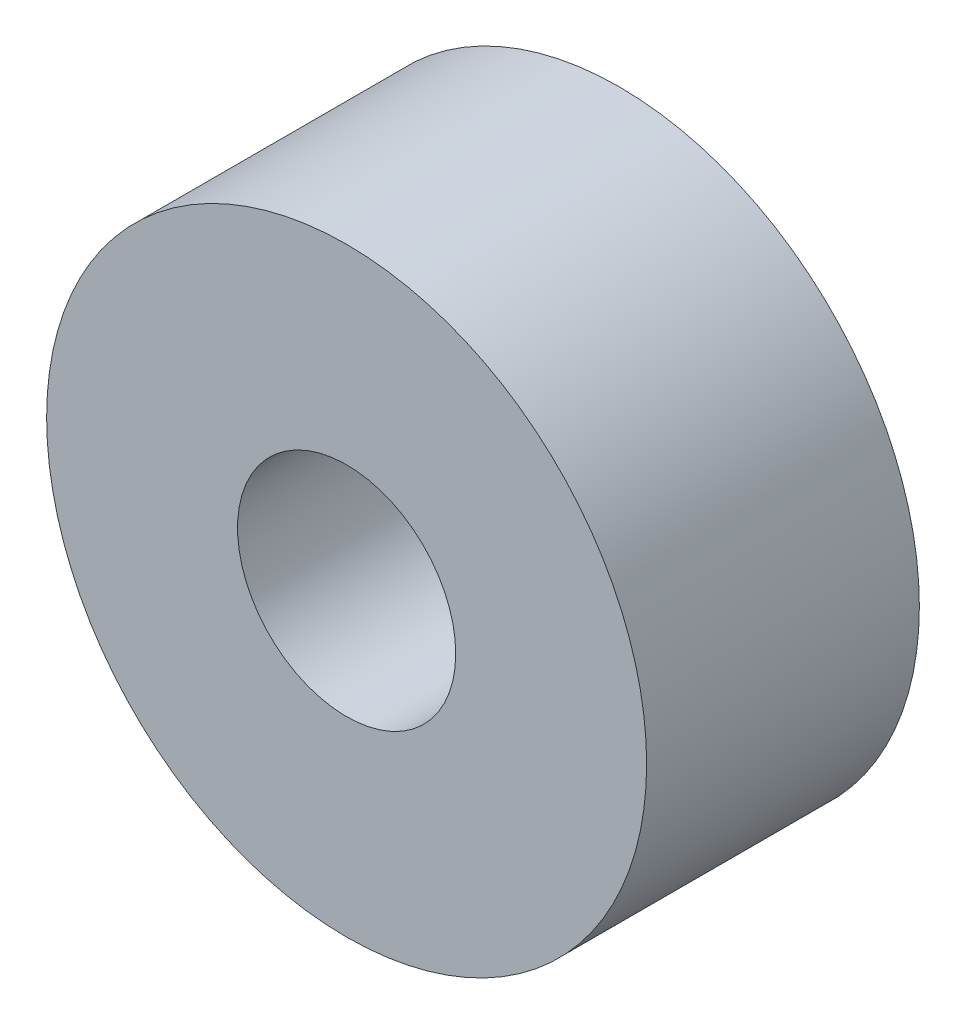
ISO-10303-21;
HEADER;
FILE_DESCRIPTION(('STEP AP214'),'2;1');
FILE_NAME('part.step','',(''),(''),'','','');
FILE_SCHEMA(('AUTOMOTIVE_DESIGN { 1 0 10303 214 1 1 1 1 }'));
ENDSEC;
DATA;
#1=APPLICATION_CONTEXT('core data for automotive mechanical design processes');
#2=APPLICATION_PROTOCOL_DEFINITION('international standard','automotive_design',2000,#1);
#3=PRODUCT_CONTEXT('',#1,'mechanical');
#4=PRODUCT('Part','Part','',(#3));
#5=PRODUCT_RELATED_PRODUCT_CATEGORY('part','',(#4));
#6=PRODUCT_DEFINITION_FORMATION('','',#4);
#7=PRODUCT_DEFINITION_CONTEXT('part definition',#1,'design');
#8=PRODUCT_DEFINITION('design','',#6,#7);
#9=PRODUCT_DEFINITION_SHAPE('','',#8);
#10=(LENGTH_UNIT() NAMED_UNIT(*) SI_UNIT(.MILLI.,.METRE.));
#11=(NAMED_UNIT(*) PLANE_ANGLE_UNIT() SI_UNIT($,.RADIAN.));
#12=(NAMED_UNIT(*) SI_UNIT($,.STERADIAN.) SOLID_ANGLE_UNIT());
#13=UNCERTAINTY_MEASURE_WITH_UNIT(LENGTH_MEASURE(1.E-05),#10,'distance_accuracy_value','');
#14=(GEOMETRIC_REPRESENTATION_CONTEXT(3) GLOBAL_UNCERTAINTY_ASSIGNED_CONTEXT((#13)) GLOBAL_UNIT_ASSIGNED_CONTEXT((#10,
#11,#12)) REPRESENTATION_CONTEXT('',''));
#15=CARTESIAN_POINT('',(0.,0.,0.));
#16=DIRECTION('',(0.,0.,1.));
#17=DIRECTION('',(1.,0.,0.));
#18=AXIS2_PLACEMENT_3D('',#15,#16,#17);
#19=CARTESIAN_POINT('',(0.,0.,7.9375));
#20=DIRECTION('',(0.,0.,1.));
#21=DIRECTION('',(1.,0.,0.));
#22=AXIS2_PLACEMENT_3D('',#19,#20,#21);
#23=PLANE('',#22);
#24=CARTESIAN_POINT('',(0.,0.,7.9375));
#25=DIRECTION('',(0.,0.,1.));
#26=DIRECTION('',(1.,0.,0.));
#27=AXIS2_PLACEMENT_3D('',#24,#25,#26);
#28=CIRCLE('',#27,8.73125);
#29=CARTESIAN_POINT('',(8.73125,0.,7.9375));
#30=VERTEX_POINT('',#29);
#31=EDGE_CURVE('E10',#30,#30,#28,.T.);
#32=ORIENTED_EDGE('',*,*,#31,.T.);
#33=EDGE_LOOP('',(#32));
#34=FACE_BOUND('',#33,.T.);
#35=CARTESIAN_POINT('',(0.,0.,7.9375));
#36=DIRECTION('',(0.,0.,1.));
#37=DIRECTION('',(1.,0.,0.));
#38=AXIS2_PLACEMENT_3D('',#35,#36,#37);
#39=CIRCLE('',#38,3.175);
#40=CARTESIAN_POINT('',(3.175,0.,7.9375));
#41=VERTEX_POINT('',#40);
#42=EDGE_CURVE('E50',#41,#41,#39,.T.);
#43=ORIENTED_EDGE('',*,*,#42,.F.);
#44=EDGE_LOOP('',(#43));
#45=FACE_BOUND('',#44,.T.);
#46=ADVANCED_FACE('F37',(#34,#45),#23,.T.);
#47=CARTESIAN_POINT('',(0.,0.,0.));
#48=DIRECTION('',(0.,0.,1.));
#49=DIRECTION('',(1.,0.,0.));
#50=AXIS2_PLACEMENT_3D('',#47,#48,#49);
#51=PLANE('',#50);
#52=CARTESIAN_POINT('',(0.,0.,0.));
#53=DIRECTION('',(0.,0.,1.));
#54=DIRECTION('',(1.,0.,0.));
#55=AXIS2_PLACEMENT_3D('',#52,#53,#54);
#56=CIRCLE('',#55,8.73125);
#57=CARTESIAN_POINT('',(8.73125,0.,0.));
#58=VERTEX_POINT('',#57);
#59=EDGE_CURVE('E41',#58,#58,#56,.T.);
#60=ORIENTED_EDGE('',*,*,#59,.F.);
#61=EDGE_LOOP('',(#60));
#62=FACE_BOUND('',#61,.T.);
#63=CARTESIAN_POINT('',(0.,0.,0.));
#64=DIRECTION('',(0.,0.,1.));
#65=DIRECTION('',(1.,0.,0.));
#66=AXIS2_PLACEMENT_3D('',#63,#64,#65);
#67=CIRCLE('',#66,3.175);
#68=CARTESIAN_POINT('',(3.175,0.,0.));
#69=VERTEX_POINT('',#68);
#70=EDGE_CURVE('E52',#69,#69,#67,.T.);
#71=ORIENTED_EDGE('',*,*,#70,.T.);
#72=EDGE_LOOP('',(#71));
#73=FACE_BOUND('',#72,.T.);
#74=ADVANCED_FACE('F64',(#62,#73),#51,.F.);
#75=CARTESIAN_POINT('',(0.,0.,7.9375));
#76=DIRECTION('',(0.,0.,-1.));
#77=DIRECTION('',(-1.,0.,0.));
#78=AXIS2_PLACEMENT_3D('',#75,#76,#77);
#79=CYLINDRICAL_SURFACE('',#78,8.73125);
#80=ORIENTED_EDGE('',*,*,#31,.F.);
#81=EDGE_LOOP('',(#80));
#82=FACE_BOUND('',#81,.T.);
#83=ORIENTED_EDGE('',*,*,#59,.T.);
#84=EDGE_LOOP('',(#83));
#85=FACE_BOUND('',#84,.T.);
#86=ADVANCED_FACE('F39',(#82,#85),#79,.T.);
#87=CARTESIAN_POINT('',(0.,0.,7.9375));
#88=DIRECTION('',(0.,0.,-1.));
#89=DIRECTION('',(-1.,0.,0.));
#90=AXIS2_PLACEMENT_3D('',#87,#88,#89);
#91=CYLINDRICAL_SURFACE('',#90,3.175);
#92=ORIENTED_EDGE('',*,*,#42,.T.);
#93=EDGE_LOOP('',(#92));
#94=FACE_BOUND('',#93,.T.);
#95=ORIENTED_EDGE('',*,*,#70,.F.);
#96=EDGE_LOOP('',(#95));
#97=FACE_BOUND('',#96,.T.);
#98=ADVANCED_FACE('F60',(#94,#97),#91,.F.);
#99=CLOSED_SHELL('',(#46,#74,#86,#98));
#100=MANIFOLD_SOLID_BREP('B2',#99);
#101=ADVANCED_BREP_SHAPE_REPRESENTATION('',(#18,#100),#14);
#102=SHAPE_DEFINITION_REPRESENTATION(#9,#101);
ENDSEC;
END-ISO-10303-21;
